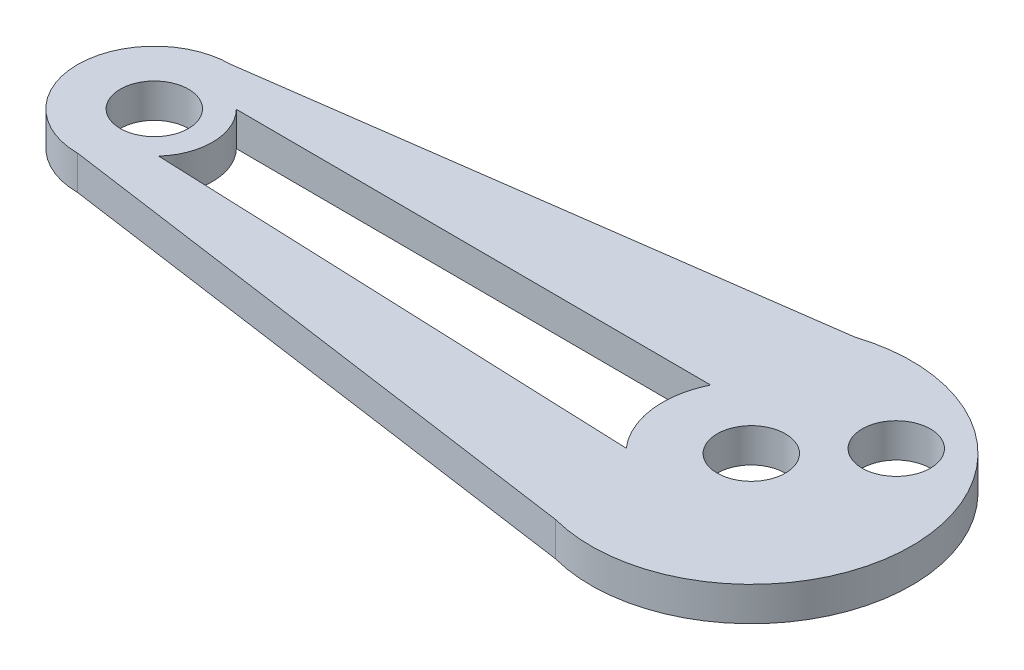
ISO-10303-21;
HEADER;
FILE_DESCRIPTION(('STEP AP214'),'2;1');
FILE_NAME('part.step','',(''),(''),'','','');
FILE_SCHEMA(('AUTOMOTIVE_DESIGN { 1 0 10303 214 1 1 1 1 }'));
ENDSEC;
DATA;
#1=APPLICATION_CONTEXT('core data for automotive mechanical design processes');
#2=APPLICATION_PROTOCOL_DEFINITION('international standard','automotive_design',2000,#1);
#3=PRODUCT_CONTEXT('',#1,'mechanical');
#4=PRODUCT('Part','Part','',(#3));
#5=PRODUCT_RELATED_PRODUCT_CATEGORY('part','',(#4));
#6=PRODUCT_DEFINITION_FORMATION('','',#4);
#7=PRODUCT_DEFINITION_CONTEXT('part definition',#1,'design');
#8=PRODUCT_DEFINITION('design','',#6,#7);
#9=PRODUCT_DEFINITION_SHAPE('','',#8);
#10=(LENGTH_UNIT() NAMED_UNIT(*) SI_UNIT(.MILLI.,.METRE.));
#11=(NAMED_UNIT(*) PLANE_ANGLE_UNIT() SI_UNIT($,.RADIAN.));
#12=(NAMED_UNIT(*) SI_UNIT($,.STERADIAN.) SOLID_ANGLE_UNIT());
#13=UNCERTAINTY_MEASURE_WITH_UNIT(LENGTH_MEASURE(1.E-05),#10,'distance_accuracy_value','');
#14=(GEOMETRIC_REPRESENTATION_CONTEXT(3) GLOBAL_UNCERTAINTY_ASSIGNED_CONTEXT((#13)) GLOBAL_UNIT_ASSIGNED_CONTEXT((#10,
#11,#12)) REPRESENTATION_CONTEXT('',''));
#15=CARTESIAN_POINT('',(0.,0.,0.));
#16=DIRECTION('',(0.,0.,1.));
#17=DIRECTION('',(1.,0.,0.));
#18=AXIS2_PLACEMENT_3D('',#15,#16,#17);
#19=CARTESIAN_POINT('',(-16.6301514382403,2.,9.5027395534472));
#20=DIRECTION('',(0.,1.,0.));
#21=DIRECTION('',(0.,0.,1.));
#22=AXIS2_PLACEMENT_3D('',#19,#20,#21);
#23=PLANE('',#22);
#24=DIRECTION('',(0.999221699685023,0.,0.0394461009299335));
#25=VECTOR('',#24,1.);
#26=CARTESIAN_POINT('',(-49.1020104297136,2.,11.7761737488893));
#27=LINE('',#26,#25);
#28=CARTESIAN_POINT('',(-49.1020104297136,2.,11.7761737488893));
#29=VERTEX_POINT('',#28);
#30=CARTESIAN_POINT('',(-20.5646145528215,2.,12.9027395534472));
#31=VERTEX_POINT('',#30);
#32=EDGE_CURVE('E106',#29,#31,#27,.T.);
#33=ORIENTED_EDGE('',*,*,#32,.F.);
#34=CARTESIAN_POINT('',(-51.6301514382403,2.,9.5027395534472));
#35=DIRECTION('',(0.,-1.,0.));
#36=DIRECTION('',(0.,0.,1.));
#37=AXIS2_PLACEMENT_3D('',#34,#35,#36);
#38=CIRCLE('',#37,3.4);
#39=CARTESIAN_POINT('',(-49.2020104297136,2.,7.12279601573231));
#40=VERTEX_POINT('',#39);
#41=EDGE_CURVE('E98',#40,#29,#38,.T.);
#42=ORIENTED_EDGE('',*,*,#41,.F.);
#43=DIRECTION('',(-0.999994008127209,0.,-0.0034617495114107));
#44=VECTOR('',#43,1.);
#45=CARTESIAN_POINT('',(-49.2020104297136,2.,7.12279601573231));
#46=LINE('',#45,#44);
#47=CARTESIAN_POINT('',(-21.3020104297136,2.,7.21937940581605));
#48=VERTEX_POINT('',#47);
#49=EDGE_CURVE('E121',#48,#40,#46,.T.);
#50=ORIENTED_EDGE('',*,*,#49,.F.);
#51=CARTESIAN_POINT('',(-16.6301514382403,2.,9.5027395534472));
#52=DIRECTION('',(0.,-1.,0.));
#53=DIRECTION('',(0.,0.,1.));
#54=AXIS2_PLACEMENT_3D('',#51,#52,#53);
#55=CIRCLE('',#54,5.2);
#56=EDGE_CURVE('E119',#31,#48,#55,.T.);
#57=ORIENTED_EDGE('',*,*,#56,.F.);
#58=EDGE_LOOP('',(#33,#42,#50,#57));
#59=FACE_BOUND('',#58,.T.);
#60=CARTESIAN_POINT('',(-16.6301514382403,2.,9.5027395534472));
#61=DIRECTION('',(0.,1.,0.));
#62=DIRECTION('',(0.,0.,1.));
#63=AXIS2_PLACEMENT_3D('',#60,#61,#62);
#64=CIRCLE('',#63,2.);
#65=CARTESIAN_POINT('',(-16.6301514382403,2.,11.5027395534472));
#66=VERTEX_POINT('',#65);
#67=EDGE_CURVE('E143',#66,#66,#64,.T.);
#68=ORIENTED_EDGE('',*,*,#67,.F.);
#69=EDGE_LOOP('',(#68));
#70=FACE_BOUND('',#69,.T.);
#71=CARTESIAN_POINT('',(-16.6301514382403,2.,9.5027395534472));
#72=DIRECTION('',(0.,1.,0.));
#73=DIRECTION('',(0.,0.,1.));
#74=AXIS2_PLACEMENT_3D('',#71,#72,#73);
#75=CIRCLE('',#74,9.4);
#76=CARTESIAN_POINT('',(-19.0301514382403,2.,18.5911937674486));
#77=VERTEX_POINT('',#76);
#78=CARTESIAN_POINT('',(-19.5204603504899,2.,0.558125845087819));
#79=VERTEX_POINT('',#78);
#80=EDGE_CURVE('E149',#77,#79,#75,.T.);
#81=ORIENTED_EDGE('',*,*,#80,.T.);
#82=DIRECTION('',(-0.990555496709447,0.,0.137112391630735));
#83=VECTOR('',#82,1.);
#84=CARTESIAN_POINT('',(-51.6301514382403,2.,5.0027395534472));
#85=LINE('',#84,#83);
#86=CARTESIAN_POINT('',(-51.6301514382403,2.,5.0027395534472));
#87=VERTEX_POINT('',#86);
#88=EDGE_CURVE('E152',#79,#87,#85,.T.);
#89=ORIENTED_EDGE('',*,*,#88,.T.);
#90=CARTESIAN_POINT('',(-51.6301514382403,2.,9.5027395534472));
#91=DIRECTION('',(0.,1.,0.));
#92=DIRECTION('',(0.,0.,1.));
#93=AXIS2_PLACEMENT_3D('',#90,#91,#92);
#94=CIRCLE('',#93,4.5);
#95=CARTESIAN_POINT('',(-51.6301514382403,2.,14.0027395534472));
#96=VERTEX_POINT('',#95);
#97=EDGE_CURVE('E155',#87,#96,#94,.T.);
#98=ORIENTED_EDGE('',*,*,#97,.T.);
#99=DIRECTION('',(0.990239484725253,0.,0.139376335477245));
#100=VECTOR('',#99,1.);
#101=CARTESIAN_POINT('',(-51.6301514382403,2.,14.0027395534472));
#102=LINE('',#101,#100);
#103=EDGE_CURVE('E157',#96,#77,#102,.T.);
#104=ORIENTED_EDGE('',*,*,#103,.T.);
#105=EDGE_LOOP('',(#81,#89,#98,#104));
#106=FACE_BOUND('',#105,.T.);
#107=CARTESIAN_POINT('',(-12.6301514382403,2.,5.0027395534472));
#108=DIRECTION('',(0.,1.,0.));
#109=DIRECTION('',(0.,0.,1.));
#110=AXIS2_PLACEMENT_3D('',#107,#108,#109);
#111=CIRCLE('',#110,2.);
#112=CARTESIAN_POINT('',(-12.6301514382403,2.,7.0027395534472));
#113=VERTEX_POINT('',#112);
#114=EDGE_CURVE('E137',#113,#113,#111,.T.);
#115=ORIENTED_EDGE('',*,*,#114,.F.);
#116=EDGE_LOOP('',(#115));
#117=FACE_BOUND('',#116,.T.);
#118=CARTESIAN_POINT('',(-51.6301514382403,2.,9.5027395534472));
#119=DIRECTION('',(0.,1.,0.));
#120=DIRECTION('',(0.,0.,1.));
#121=AXIS2_PLACEMENT_3D('',#118,#119,#120);
#122=CIRCLE('',#121,2.);
#123=CARTESIAN_POINT('',(-51.6301514382403,2.,11.5027395534472));
#124=VERTEX_POINT('',#123);
#125=EDGE_CURVE('E127',#124,#124,#122,.T.);
#126=ORIENTED_EDGE('',*,*,#125,.F.);
#127=EDGE_LOOP('',(#126));
#128=FACE_BOUND('',#127,.T.);
#129=ADVANCED_FACE('F33',(#59,#70,#106,#117,#128),#23,.T.);
#130=CARTESIAN_POINT('',(-16.6301514382403,0.,9.5027395534472));
#131=DIRECTION('',(0.,1.,0.));
#132=DIRECTION('',(0.,0.,1.));
#133=AXIS2_PLACEMENT_3D('',#130,#131,#132);
#134=PLANE('',#133);
#135=CARTESIAN_POINT('',(-51.6301514382403,0.,9.5027395534472));
#136=DIRECTION('',(0.,-1.,0.));
#137=DIRECTION('',(0.,0.,1.));
#138=AXIS2_PLACEMENT_3D('',#135,#136,#137);
#139=CIRCLE('',#138,3.4);
#140=CARTESIAN_POINT('',(-49.2020104297136,0.,7.12279601573231));
#141=VERTEX_POINT('',#140);
#142=CARTESIAN_POINT('',(-49.1020104297136,0.,11.7761737488893));
#143=VERTEX_POINT('',#142);
#144=EDGE_CURVE('E56',#141,#143,#139,.T.);
#145=ORIENTED_EDGE('',*,*,#144,.T.);
#146=DIRECTION('',(0.999221699685023,0.,0.0394461009299335));
#147=VECTOR('',#146,1.);
#148=CARTESIAN_POINT('',(-49.1020104297136,0.,11.7761737488893));
#149=LINE('',#148,#147);
#150=CARTESIAN_POINT('',(-20.5646145528215,0.,12.9027395534472));
#151=VERTEX_POINT('',#150);
#152=EDGE_CURVE('E113',#143,#151,#149,.T.);
#153=ORIENTED_EDGE('',*,*,#152,.T.);
#154=CARTESIAN_POINT('',(-16.6301514382403,0.,9.5027395534472));
#155=DIRECTION('',(0.,-1.,0.));
#156=DIRECTION('',(0.,0.,1.));
#157=AXIS2_PLACEMENT_3D('',#154,#155,#156);
#158=CIRCLE('',#157,5.2);
#159=CARTESIAN_POINT('',(-21.3020104297136,0.,7.21937940581605));
#160=VERTEX_POINT('',#159);
#161=EDGE_CURVE('E129',#151,#160,#158,.T.);
#162=ORIENTED_EDGE('',*,*,#161,.T.);
#163=DIRECTION('',(-0.999994008127209,0.,-0.0034617495114107));
#164=VECTOR('',#163,1.);
#165=CARTESIAN_POINT('',(-49.2020104297136,0.,7.12279601573231));
#166=LINE('',#165,#164);
#167=EDGE_CURVE('E107',#160,#141,#166,.T.);
#168=ORIENTED_EDGE('',*,*,#167,.T.);
#169=EDGE_LOOP('',(#145,#153,#162,#168));
#170=FACE_BOUND('',#169,.T.);
#171=CARTESIAN_POINT('',(-16.6301514382403,0.,9.5027395534472));
#172=DIRECTION('',(0.,1.,0.));
#173=DIRECTION('',(0.,0.,1.));
#174=AXIS2_PLACEMENT_3D('',#171,#172,#173);
#175=CIRCLE('',#174,2.);
#176=CARTESIAN_POINT('',(-16.6301514382403,0.,11.5027395534472));
#177=VERTEX_POINT('',#176);
#178=EDGE_CURVE('E140',#177,#177,#175,.T.);
#179=ORIENTED_EDGE('',*,*,#178,.T.);
#180=EDGE_LOOP('',(#179));
#181=FACE_BOUND('',#180,.T.);
#182=CARTESIAN_POINT('',(-16.6301514382403,0.,9.5027395534472));
#183=DIRECTION('',(0.,1.,0.));
#184=DIRECTION('',(0.,0.,1.));
#185=AXIS2_PLACEMENT_3D('',#182,#183,#184);
#186=CIRCLE('',#185,9.4);
#187=CARTESIAN_POINT('',(-19.0301514382403,0.,18.5911937674486));
#188=VERTEX_POINT('',#187);
#189=CARTESIAN_POINT('',(-19.5204603504899,0.,0.558125845087819));
#190=VERTEX_POINT('',#189);
#191=EDGE_CURVE('E146',#188,#190,#186,.T.);
#192=ORIENTED_EDGE('',*,*,#191,.F.);
#193=DIRECTION('',(0.990239484725253,0.,0.139376335477245));
#194=VECTOR('',#193,1.);
#195=CARTESIAN_POINT('',(-51.6301514382403,0.,14.0027395534472));
#196=LINE('',#195,#194);
#197=CARTESIAN_POINT('',(-51.6301514382403,0.,14.0027395534472));
#198=VERTEX_POINT('',#197);
#199=EDGE_CURVE('E153',#198,#188,#196,.T.);
#200=ORIENTED_EDGE('',*,*,#199,.F.);
#201=CARTESIAN_POINT('',(-51.6301514382403,0.,9.5027395534472));
#202=DIRECTION('',(0.,1.,0.));
#203=DIRECTION('',(0.,0.,1.));
#204=AXIS2_PLACEMENT_3D('',#201,#202,#203);
#205=CIRCLE('',#204,4.5);
#206=CARTESIAN_POINT('',(-51.6301514382403,0.,5.0027395534472));
#207=VERTEX_POINT('',#206);
#208=EDGE_CURVE('E164',#207,#198,#205,.T.);
#209=ORIENTED_EDGE('',*,*,#208,.F.);
#210=DIRECTION('',(-0.990555496709447,0.,0.137112391630735));
#211=VECTOR('',#210,1.);
#212=CARTESIAN_POINT('',(-51.6301514382403,0.,5.0027395534472));
#213=LINE('',#212,#211);
#214=EDGE_CURVE('E162',#190,#207,#213,.T.);
#215=ORIENTED_EDGE('',*,*,#214,.F.);
#216=EDGE_LOOP('',(#192,#200,#209,#215));
#217=FACE_BOUND('',#216,.T.);
#218=CARTESIAN_POINT('',(-12.6301514382403,0.,5.0027395534472));
#219=DIRECTION('',(0.,1.,0.));
#220=DIRECTION('',(0.,0.,1.));
#221=AXIS2_PLACEMENT_3D('',#218,#219,#220);
#222=CIRCLE('',#221,2.);
#223=CARTESIAN_POINT('',(-12.6301514382403,0.,7.0027395534472));
#224=VERTEX_POINT('',#223);
#225=EDGE_CURVE('E114',#224,#224,#222,.T.);
#226=ORIENTED_EDGE('',*,*,#225,.T.);
#227=EDGE_LOOP('',(#226));
#228=FACE_BOUND('',#227,.T.);
#229=CARTESIAN_POINT('',(-51.6301514382403,0.,9.5027395534472));
#230=DIRECTION('',(0.,1.,0.));
#231=DIRECTION('',(0.,0.,1.));
#232=AXIS2_PLACEMENT_3D('',#229,#230,#231);
#233=CIRCLE('',#232,2.);
#234=CARTESIAN_POINT('',(-51.6301514382403,0.,11.5027395534472));
#235=VERTEX_POINT('',#234);
#236=EDGE_CURVE('E250',#235,#235,#233,.T.);
#237=ORIENTED_EDGE('',*,*,#236,.T.);
#238=EDGE_LOOP('',(#237));
#239=FACE_BOUND('',#238,.T.);
#240=ADVANCED_FACE('F182',(#170,#181,#217,#228,#239),#134,.F.);
#241=CARTESIAN_POINT('',(-16.6301514382403,2.,9.5027395534472));
#242=DIRECTION('',(0.,-1.,0.));
#243=DIRECTION('',(0.,0.,-1.));
#244=AXIS2_PLACEMENT_3D('',#241,#242,#243);
#245=CYLINDRICAL_SURFACE('',#244,9.4);
#246=ORIENTED_EDGE('',*,*,#191,.T.);
#247=DIRECTION('',(0.,-1.,0.));
#248=VECTOR('',#247,1.);
#249=CARTESIAN_POINT('',(-19.5204603504899,2.,0.558125845087819));
#250=LINE('',#249,#248);
#251=EDGE_CURVE('E11',#79,#190,#250,.T.);
#252=ORIENTED_EDGE('',*,*,#251,.F.);
#253=ORIENTED_EDGE('',*,*,#80,.F.);
#254=DIRECTION('',(0.,-1.,0.));
#255=VECTOR('',#254,1.);
#256=CARTESIAN_POINT('',(-19.0301514382403,2.,18.5911937674486));
#257=LINE('',#256,#255);
#258=EDGE_CURVE('E159',#77,#188,#257,.T.);
#259=ORIENTED_EDGE('',*,*,#258,.T.);
#260=EDGE_LOOP('',(#246,#252,#253,#259));
#261=FACE_BOUND('',#260,.T.);
#262=ADVANCED_FACE('F35',(#261),#245,.T.);
#263=CARTESIAN_POINT('',(-51.6301514382403,2.,5.0027395534472));
#264=DIRECTION('',(0.137112391630735,0.,0.990555496709447));
#265=DIRECTION('',(0.990555496709447,0.,-0.137112391630735));
#266=AXIS2_PLACEMENT_3D('',#263,#264,#265);
#267=PLANE('',#266);
#268=ORIENTED_EDGE('',*,*,#214,.T.);
#269=DIRECTION('',(0.,-1.,0.));
#270=VECTOR('',#269,1.);
#271=CARTESIAN_POINT('',(-51.6301514382403,2.,5.0027395534472));
#272=LINE('',#271,#270);
#273=EDGE_CURVE('E41',#87,#207,#272,.T.);
#274=ORIENTED_EDGE('',*,*,#273,.F.);
#275=ORIENTED_EDGE('',*,*,#88,.F.);
#276=ORIENTED_EDGE('',*,*,#251,.T.);
#277=EDGE_LOOP('',(#268,#274,#275,#276));
#278=FACE_BOUND('',#277,.T.);
#279=ADVANCED_FACE('F193',(#278),#267,.F.);
#280=CARTESIAN_POINT('',(-51.6301514382403,2.,9.5027395534472));
#281=DIRECTION('',(0.,-1.,0.));
#282=DIRECTION('',(0.,0.,-1.));
#283=AXIS2_PLACEMENT_3D('',#280,#281,#282);
#284=CYLINDRICAL_SURFACE('',#283,4.5);
#285=ORIENTED_EDGE('',*,*,#208,.T.);
#286=DIRECTION('',(0.,-1.,0.));
#287=VECTOR('',#286,1.);
#288=CARTESIAN_POINT('',(-51.6301514382403,2.,14.0027395534472));
#289=LINE('',#288,#287);
#290=EDGE_CURVE('E169',#96,#198,#289,.T.);
#291=ORIENTED_EDGE('',*,*,#290,.F.);
#292=ORIENTED_EDGE('',*,*,#97,.F.);
#293=ORIENTED_EDGE('',*,*,#273,.T.);
#294=EDGE_LOOP('',(#285,#291,#292,#293));
#295=FACE_BOUND('',#294,.T.);
#296=ADVANCED_FACE('F176',(#295),#284,.T.);
#297=CARTESIAN_POINT('',(-51.6301514382403,2.,14.0027395534472));
#298=DIRECTION('',(0.139376335477245,0.,-0.990239484725253));
#299=DIRECTION('',(-0.990239484725253,0.,-0.139376335477245));
#300=AXIS2_PLACEMENT_3D('',#297,#298,#299);
#301=PLANE('',#300);
#302=ORIENTED_EDGE('',*,*,#199,.T.);
#303=ORIENTED_EDGE('',*,*,#258,.F.);
#304=ORIENTED_EDGE('',*,*,#103,.F.);
#305=ORIENTED_EDGE('',*,*,#290,.T.);
#306=EDGE_LOOP('',(#302,#303,#304,#305));
#307=FACE_BOUND('',#306,.T.);
#308=ADVANCED_FACE('F186',(#307),#301,.F.);
#309=CARTESIAN_POINT('',(-16.6301514382403,2.,9.5027395534472));
#310=DIRECTION('',(0.,-1.,0.));
#311=DIRECTION('',(0.,0.,-1.));
#312=AXIS2_PLACEMENT_3D('',#309,#310,#311);
#313=CYLINDRICAL_SURFACE('',#312,2.);
#314=ORIENTED_EDGE('',*,*,#67,.T.);
#315=EDGE_LOOP('',(#314));
#316=FACE_BOUND('',#315,.T.);
#317=ORIENTED_EDGE('',*,*,#178,.F.);
#318=EDGE_LOOP('',(#317));
#319=FACE_BOUND('',#318,.T.);
#320=ADVANCED_FACE('F208',(#316,#319),#313,.F.);
#321=CARTESIAN_POINT('',(-12.6301514382403,2.,5.0027395534472));
#322=DIRECTION('',(0.,-1.,0.));
#323=DIRECTION('',(0.,0.,-1.));
#324=AXIS2_PLACEMENT_3D('',#321,#322,#323);
#325=CYLINDRICAL_SURFACE('',#324,2.);
#326=ORIENTED_EDGE('',*,*,#114,.T.);
#327=EDGE_LOOP('',(#326));
#328=FACE_BOUND('',#327,.T.);
#329=ORIENTED_EDGE('',*,*,#225,.F.);
#330=EDGE_LOOP('',(#329));
#331=FACE_BOUND('',#330,.T.);
#332=ADVANCED_FACE('F215',(#328,#331),#325,.F.);
#333=CARTESIAN_POINT('',(-51.6301514382403,2.,9.5027395534472));
#334=DIRECTION('',(0.,-1.,0.));
#335=DIRECTION('',(0.,0.,-1.));
#336=AXIS2_PLACEMENT_3D('',#333,#334,#335);
#337=CYLINDRICAL_SURFACE('',#336,3.4);
#338=ORIENTED_EDGE('',*,*,#144,.F.);
#339=DIRECTION('',(0.,-1.,0.));
#340=VECTOR('',#339,1.);
#341=CARTESIAN_POINT('',(-49.2020104297136,2.,7.12279601573231));
#342=LINE('',#341,#340);
#343=EDGE_CURVE('E102',#40,#141,#342,.T.);
#344=ORIENTED_EDGE('',*,*,#343,.F.);
#345=ORIENTED_EDGE('',*,*,#41,.T.);
#346=DIRECTION('',(0.,-1.,0.));
#347=VECTOR('',#346,1.);
#348=CARTESIAN_POINT('',(-49.1020104297136,2.,11.7761737488893));
#349=LINE('',#348,#347);
#350=EDGE_CURVE('E101',#29,#143,#349,.T.);
#351=ORIENTED_EDGE('',*,*,#350,.T.);
#352=EDGE_LOOP('',(#338,#344,#345,#351));
#353=FACE_BOUND('',#352,.T.);
#354=ADVANCED_FACE('F100',(#353),#337,.T.);
#355=CARTESIAN_POINT('',(-49.1020104297136,2.,11.7761737488893));
#356=DIRECTION('',(0.0394461009299335,0.,-0.999221699685023));
#357=DIRECTION('',(-0.999221699685023,0.,-0.0394461009299335));
#358=AXIS2_PLACEMENT_3D('',#355,#356,#357);
#359=PLANE('',#358);
#360=ORIENTED_EDGE('',*,*,#152,.F.);
#361=ORIENTED_EDGE('',*,*,#350,.F.);
#362=ORIENTED_EDGE('',*,*,#32,.T.);
#363=DIRECTION('',(0.,-1.,0.));
#364=VECTOR('',#363,1.);
#365=CARTESIAN_POINT('',(-20.5646145528215,2.,12.9027395534472));
#366=LINE('',#365,#364);
#367=EDGE_CURVE('E115',#31,#151,#366,.T.);
#368=ORIENTED_EDGE('',*,*,#367,.T.);
#369=EDGE_LOOP('',(#360,#361,#362,#368));
#370=FACE_BOUND('',#369,.T.);
#371=ADVANCED_FACE('F110',(#370),#359,.T.);
#372=CARTESIAN_POINT('',(-16.6301514382403,2.,9.5027395534472));
#373=DIRECTION('',(0.,-1.,0.));
#374=DIRECTION('',(0.,0.,-1.));
#375=AXIS2_PLACEMENT_3D('',#372,#373,#374);
#376=CYLINDRICAL_SURFACE('',#375,5.2);
#377=ORIENTED_EDGE('',*,*,#161,.F.);
#378=ORIENTED_EDGE('',*,*,#367,.F.);
#379=ORIENTED_EDGE('',*,*,#56,.T.);
#380=DIRECTION('',(0.,-1.,0.));
#381=VECTOR('',#380,1.);
#382=CARTESIAN_POINT('',(-21.3020104297136,2.,7.21937940581605));
#383=LINE('',#382,#381);
#384=EDGE_CURVE('E48',#48,#160,#383,.T.);
#385=ORIENTED_EDGE('',*,*,#384,.T.);
#386=EDGE_LOOP('',(#377,#378,#379,#385));
#387=FACE_BOUND('',#386,.T.);
#388=ADVANCED_FACE('F233',(#387),#376,.T.);
#389=CARTESIAN_POINT('',(-49.2020104297136,2.,7.12279601573231));
#390=DIRECTION('',(-0.0034617495114107,0.,0.999994008127209));
#391=DIRECTION('',(0.999994008127209,0.,0.0034617495114107));
#392=AXIS2_PLACEMENT_3D('',#389,#390,#391);
#393=PLANE('',#392);
#394=ORIENTED_EDGE('',*,*,#167,.F.);
#395=ORIENTED_EDGE('',*,*,#384,.F.);
#396=ORIENTED_EDGE('',*,*,#49,.T.);
#397=ORIENTED_EDGE('',*,*,#343,.T.);
#398=EDGE_LOOP('',(#394,#395,#396,#397));
#399=FACE_BOUND('',#398,.T.);
#400=ADVANCED_FACE('F236',(#399),#393,.T.);
#401=CARTESIAN_POINT('',(-51.6301514382403,2.,9.5027395534472));
#402=DIRECTION('',(0.,-1.,0.));
#403=DIRECTION('',(0.,0.,-1.));
#404=AXIS2_PLACEMENT_3D('',#401,#402,#403);
#405=CYLINDRICAL_SURFACE('',#404,2.);
#406=ORIENTED_EDGE('',*,*,#125,.T.);
#407=EDGE_LOOP('',(#406));
#408=FACE_BOUND('',#407,.T.);
#409=ORIENTED_EDGE('',*,*,#236,.F.);
#410=EDGE_LOOP('',(#409));
#411=FACE_BOUND('',#410,.T.);
#412=ADVANCED_FACE('F240',(#408,#411),#405,.F.);
#413=CLOSED_SHELL('',(#129,#240,#262,#279,#296,#308,#320,#332,#354,#371,#388,#400,#412));
#414=MANIFOLD_SOLID_BREP('B2',#413);
#415=ADVANCED_BREP_SHAPE_REPRESENTATION('',(#18,#414),#14);
#416=SHAPE_DEFINITION_REPRESENTATION(#9,#415);
ENDSEC;
END-ISO-10303-21;
